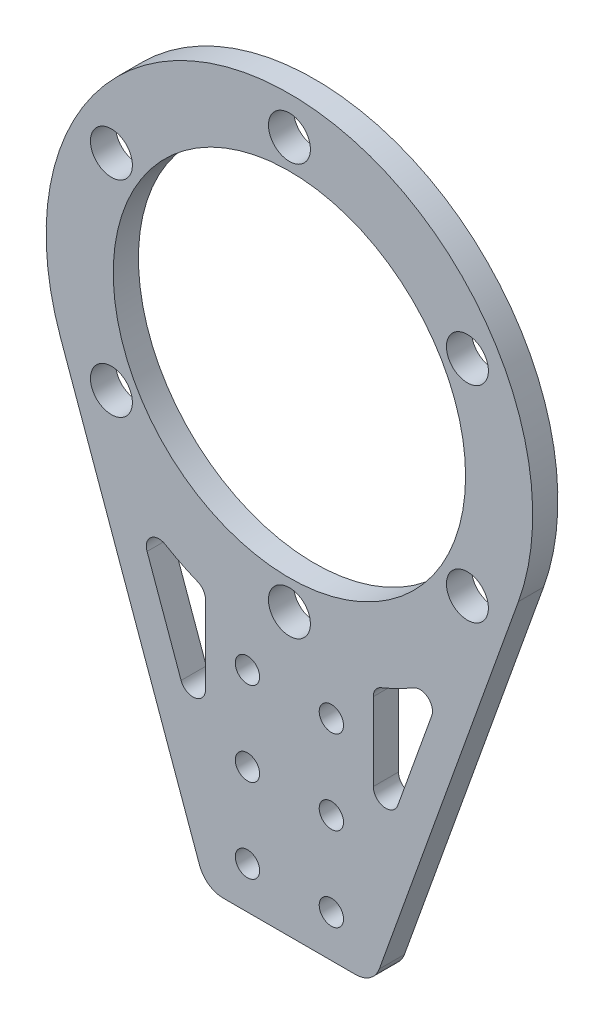
ISO-10303-21;
HEADER;
FILE_DESCRIPTION(('STEP AP214'),'2;1');
FILE_NAME('part.step','',(''),(''),'','','');
FILE_SCHEMA(('AUTOMOTIVE_DESIGN { 1 0 10303 214 1 1 1 1 }'));
ENDSEC;
DATA;
#1=APPLICATION_CONTEXT('core data for automotive mechanical design processes');
#2=APPLICATION_PROTOCOL_DEFINITION('international standard','automotive_design',2000,#1);
#3=PRODUCT_CONTEXT('',#1,'mechanical');
#4=PRODUCT('Part','Part','',(#3));
#5=PRODUCT_RELATED_PRODUCT_CATEGORY('part','',(#4));
#6=PRODUCT_DEFINITION_FORMATION('','',#4);
#7=PRODUCT_DEFINITION_CONTEXT('part definition',#1,'design');
#8=PRODUCT_DEFINITION('design','',#6,#7);
#9=PRODUCT_DEFINITION_SHAPE('','',#8);
#10=(LENGTH_UNIT() NAMED_UNIT(*) SI_UNIT(.MILLI.,.METRE.));
#11=(NAMED_UNIT(*) PLANE_ANGLE_UNIT() SI_UNIT($,.RADIAN.));
#12=(NAMED_UNIT(*) SI_UNIT($,.STERADIAN.) SOLID_ANGLE_UNIT());
#13=UNCERTAINTY_MEASURE_WITH_UNIT(LENGTH_MEASURE(1.E-05),#10,'distance_accuracy_value','');
#14=(GEOMETRIC_REPRESENTATION_CONTEXT(3) GLOBAL_UNCERTAINTY_ASSIGNED_CONTEXT((#13)) GLOBAL_UNIT_ASSIGNED_CONTEXT((#10,
#11,#12)) REPRESENTATION_CONTEXT('',''));
#15=CARTESIAN_POINT('',(0.,0.,0.));
#16=DIRECTION('',(0.,0.,1.));
#17=DIRECTION('',(1.,0.,0.));
#18=AXIS2_PLACEMENT_3D('',#15,#16,#17);
#19=CARTESIAN_POINT('',(0.,0.,3.));
#20=DIRECTION('',(0.,0.,-1.));
#21=DIRECTION('',(-1.,0.,0.));
#22=AXIS2_PLACEMENT_3D('',#19,#20,#21);
#23=PLANE('',#22);
#24=CARTESIAN_POINT('',(-5.,-33.,3.));
#25=DIRECTION('',(0.,0.,-1.));
#26=DIRECTION('',(-1.,0.,0.));
#27=AXIS2_PLACEMENT_3D('',#24,#25,#26);
#28=CIRCLE('',#27,1.45);
#29=CARTESIAN_POINT('',(-6.45,-33.,3.));
#30=VERTEX_POINT('',#29);
#31=EDGE_CURVE('E427',#30,#30,#28,.T.);
#32=ORIENTED_EDGE('',*,*,#31,.T.);
#33=EDGE_LOOP('',(#32));
#34=FACE_BOUND('',#33,.T.);
#35=CARTESIAN_POINT('',(-5.,-43.,3.));
#36=DIRECTION('',(0.,0.,-1.));
#37=DIRECTION('',(-1.,0.,0.));
#38=AXIS2_PLACEMENT_3D('',#35,#36,#37);
#39=CIRCLE('',#38,1.45);
#40=CARTESIAN_POINT('',(-6.45,-43.,3.));
#41=VERTEX_POINT('',#40);
#42=EDGE_CURVE('E434',#41,#41,#39,.T.);
#43=ORIENTED_EDGE('',*,*,#42,.T.);
#44=EDGE_LOOP('',(#43));
#45=FACE_BOUND('',#44,.T.);
#46=CARTESIAN_POINT('',(-5.,-53.,3.));
#47=DIRECTION('',(0.,0.,-1.));
#48=DIRECTION('',(-1.,0.,0.));
#49=AXIS2_PLACEMENT_3D('',#46,#47,#48);
#50=CIRCLE('',#49,1.45);
#51=CARTESIAN_POINT('',(-6.45,-53.,3.));
#52=VERTEX_POINT('',#51);
#53=EDGE_CURVE('E438',#52,#52,#50,.T.);
#54=ORIENTED_EDGE('',*,*,#53,.T.);
#55=EDGE_LOOP('',(#54));
#56=FACE_BOUND('',#55,.T.);
#57=CARTESIAN_POINT('',(5.,-53.,3.));
#58=DIRECTION('',(0.,0.,-1.));
#59=DIRECTION('',(-1.,0.,0.));
#60=AXIS2_PLACEMENT_3D('',#57,#58,#59);
#61=CIRCLE('',#60,1.45);
#62=CARTESIAN_POINT('',(3.55,-53.,3.));
#63=VERTEX_POINT('',#62);
#64=EDGE_CURVE('E442',#63,#63,#61,.T.);
#65=ORIENTED_EDGE('',*,*,#64,.T.);
#66=EDGE_LOOP('',(#65));
#67=FACE_BOUND('',#66,.T.);
#68=CARTESIAN_POINT('',(5.,-43.,3.));
#69=DIRECTION('',(0.,0.,-1.));
#70=DIRECTION('',(-1.,0.,0.));
#71=AXIS2_PLACEMENT_3D('',#68,#69,#70);
#72=CIRCLE('',#71,1.45);
#73=CARTESIAN_POINT('',(3.55,-43.,3.));
#74=VERTEX_POINT('',#73);
#75=EDGE_CURVE('E446',#74,#74,#72,.T.);
#76=ORIENTED_EDGE('',*,*,#75,.T.);
#77=EDGE_LOOP('',(#76));
#78=FACE_BOUND('',#77,.T.);
#79=CARTESIAN_POINT('',(5.,-33.,3.));
#80=DIRECTION('',(0.,0.,-1.));
#81=DIRECTION('',(-1.,0.,0.));
#82=AXIS2_PLACEMENT_3D('',#79,#80,#81);
#83=CIRCLE('',#82,1.45);
#84=CARTESIAN_POINT('',(3.55,-33.,3.));
#85=VERTEX_POINT('',#84);
#86=EDGE_CURVE('E450',#85,#85,#83,.T.);
#87=ORIENTED_EDGE('',*,*,#86,.T.);
#88=EDGE_LOOP('',(#87));
#89=FACE_BOUND('',#88,.T.);
#90=DIRECTION('',(0.337715842640856,-0.941248112683036,0.));
#91=VECTOR('',#90,1.);
#92=CARTESIAN_POINT('',(-9.99999999999999,-46.1557229630657,3.));
#93=LINE('',#92,#91);
#94=CARTESIAN_POINT('',(-16.9652563993768,-26.742850919515,3.));
#95=VERTEX_POINT('',#94);
#96=CARTESIAN_POINT('',(-12.9118721690245,-38.0400415605107,3.));
#97=VERTEX_POINT('',#96);
#98=EDGE_CURVE('E355',#95,#97,#93,.T.);
#99=ORIENTED_EDGE('',*,*,#98,.F.);
#100=CARTESIAN_POINT('',(-15.5533842303522,-26.2362771555537,3.));
#101=DIRECTION('',(0.,0.,-1.));
#102=DIRECTION('',(-1.,0.,0.));
#103=AXIS2_PLACEMENT_3D('',#100,#101,#102);
#104=CIRCLE('',#103,1.5);
#105=CARTESIAN_POINT('',(-14.7884636944333,-24.9459684429855,3.));
#106=VERTEX_POINT('',#105);
#107=EDGE_CURVE('E283',#95,#106,#104,.T.);
#108=ORIENTED_EDGE('',*,*,#107,.T.);
#109=CARTESIAN_POINT('',(0.,0.,3.));
#110=DIRECTION('',(0.,0.,-1.));
#111=DIRECTION('',(-1.,0.,0.));
#112=AXIS2_PLACEMENT_3D('',#109,#110,#111);
#113=CIRCLE('',#112,29.);
#114=CARTESIAN_POINT('',(-10.9344262295082,-26.8596039254387,3.));
#115=VERTEX_POINT('',#114);
#116=EDGE_CURVE('E347',#115,#106,#113,.T.);
#117=ORIENTED_EDGE('',*,*,#116,.F.);
#118=CARTESIAN_POINT('',(-11.5,-28.2488937836511,3.));
#119=DIRECTION('',(0.,0.,-1.));
#120=DIRECTION('',(-1.,0.,0.));
#121=AXIS2_PLACEMENT_3D('',#118,#119,#120);
#122=CIRCLE('',#121,1.5);
#123=CARTESIAN_POINT('',(-9.99999999999999,-28.2488937836511,3.));
#124=VERTEX_POINT('',#123);
#125=EDGE_CURVE('E289',#115,#124,#122,.T.);
#126=ORIENTED_EDGE('',*,*,#125,.T.);
#127=DIRECTION('',(0.,1.,0.));
#128=VECTOR('',#127,1.);
#129=CARTESIAN_POINT('',(-9.99999999999999,-46.1557229630657,3.));
#130=LINE('',#129,#128);
#131=CARTESIAN_POINT('',(-9.99999999999999,-37.5334677965494,3.));
#132=VERTEX_POINT('',#131);
#133=EDGE_CURVE('E368',#132,#124,#130,.T.);
#134=ORIENTED_EDGE('',*,*,#133,.F.);
#135=CARTESIAN_POINT('',(-11.5,-37.5334677965494,3.));
#136=DIRECTION('',(0.,0.,-1.));
#137=DIRECTION('',(-1.,0.,0.));
#138=AXIS2_PLACEMENT_3D('',#135,#136,#137);
#139=CIRCLE('',#138,1.5);
#140=EDGE_CURVE('E277',#132,#97,#139,.T.);
#141=ORIENTED_EDGE('',*,*,#140,.T.);
#142=EDGE_LOOP('',(#99,#108,#117,#126,#134,#141));
#143=FACE_BOUND('',#142,.T.);
#144=DIRECTION('',(0.337715842640856,-0.941248112683036,0.));
#145=VECTOR('',#144,1.);
#146=CARTESIAN_POINT('',(-9.99999999999999,-58.,3.));
#147=LINE('',#146,#145);
#148=CARTESIAN_POINT('',(-27.296195267808,-9.79375943658482,3.));
#149=VERTEX_POINT('',#148);
#150=CARTESIAN_POINT('',(-10.7128742653178,-56.0131475279226,3.));
#151=VERTEX_POINT('',#150);
#152=EDGE_CURVE('E213',#149,#151,#147,.T.);
#153=ORIENTED_EDGE('',*,*,#152,.T.);
#154=CARTESIAN_POINT('',(-7.8891299272687,-55.,3.));
#155=DIRECTION('',(0.,0.,-1.));
#156=DIRECTION('',(-1.,0.,0.));
#157=AXIS2_PLACEMENT_3D('',#154,#155,#156);
#158=CIRCLE('',#157,3.);
#159=CARTESIAN_POINT('',(-7.8891299272687,-58.,3.));
#160=VERTEX_POINT('',#159);
#161=EDGE_CURVE('E54',#151,#160,#158,.F.);
#162=ORIENTED_EDGE('',*,*,#161,.T.);
#163=DIRECTION('',(1.,0.,0.));
#164=VECTOR('',#163,1.);
#165=CARTESIAN_POINT('',(-9.99999999999999,-58.,3.));
#166=LINE('',#165,#164);
#167=CARTESIAN_POINT('',(7.88912992726872,-58.,3.));
#168=VERTEX_POINT('',#167);
#169=EDGE_CURVE('E180',#160,#168,#166,.T.);
#170=ORIENTED_EDGE('',*,*,#169,.T.);
#171=CARTESIAN_POINT('',(7.88912992726871,-55.,3.));
#172=DIRECTION('',(0.,0.,-1.));
#173=DIRECTION('',(-1.,0.,0.));
#174=AXIS2_PLACEMENT_3D('',#171,#172,#173);
#175=CIRCLE('',#174,3.);
#176=CARTESIAN_POINT('',(10.7128742653178,-56.0131475279226,3.));
#177=VERTEX_POINT('',#176);
#178=EDGE_CURVE('E61',#168,#177,#175,.F.);
#179=ORIENTED_EDGE('',*,*,#178,.T.);
#180=DIRECTION('',(0.337715842640856,0.941248112683036,0.));
#181=VECTOR('',#180,1.);
#182=CARTESIAN_POINT('',(10.,-58.,3.));
#183=LINE('',#182,#181);
#184=CARTESIAN_POINT('',(27.296195267808,-9.79375943658482,3.));
#185=VERTEX_POINT('',#184);
#186=EDGE_CURVE('E171',#177,#185,#183,.T.);
#187=ORIENTED_EDGE('',*,*,#186,.T.);
#188=CARTESIAN_POINT('',(0.,0.,3.));
#189=DIRECTION('',(0.,0.,1.));
#190=DIRECTION('',(-1.,0.,0.));
#191=AXIS2_PLACEMENT_3D('',#188,#189,#190);
#192=CIRCLE('',#191,29.);
#193=EDGE_CURVE('E175',#185,#149,#192,.T.);
#194=ORIENTED_EDGE('',*,*,#193,.T.);
#195=EDGE_LOOP('',(#153,#162,#170,#179,#187,#194));
#196=FACE_BOUND('',#195,.T.);
#197=CARTESIAN_POINT('',(0.,0.,3.));
#198=DIRECTION('',(0.,0.,1.));
#199=DIRECTION('',(1.,0.,0.));
#200=AXIS2_PLACEMENT_3D('',#197,#198,#199);
#201=CIRCLE('',#200,21.);
#202=CARTESIAN_POINT('',(21.,0.,3.));
#203=VERTEX_POINT('',#202);
#204=EDGE_CURVE('E205',#203,#203,#201,.T.);
#205=ORIENTED_EDGE('',*,*,#204,.F.);
#206=EDGE_LOOP('',(#205));
#207=FACE_BOUND('',#206,.T.);
#208=CARTESIAN_POINT('',(0.,24.5,3.));
#209=DIRECTION('',(0.,0.,1.));
#210=DIRECTION('',(1.,0.,0.));
#211=AXIS2_PLACEMENT_3D('',#208,#209,#210);
#212=CIRCLE('',#211,2.5);
#213=CARTESIAN_POINT('',(2.5,24.5,3.));
#214=VERTEX_POINT('',#213);
#215=EDGE_CURVE('E331',#214,#214,#212,.T.);
#216=ORIENTED_EDGE('',*,*,#215,.F.);
#217=EDGE_LOOP('',(#216));
#218=FACE_BOUND('',#217,.T.);
#219=CARTESIAN_POINT('',(21.2176223927188,12.25,3.));
#220=DIRECTION('',(0.,0.,1.));
#221=DIRECTION('',(1.,0.,0.));
#222=AXIS2_PLACEMENT_3D('',#219,#220,#221);
#223=CIRCLE('',#222,2.5);
#224=CARTESIAN_POINT('',(23.7176223927188,12.25,3.));
#225=VERTEX_POINT('',#224);
#226=EDGE_CURVE('E339',#225,#225,#223,.T.);
#227=ORIENTED_EDGE('',*,*,#226,.F.);
#228=EDGE_LOOP('',(#227));
#229=FACE_BOUND('',#228,.T.);
#230=DIRECTION('',(0.337715842640856,0.941248112683036,0.));
#231=VECTOR('',#230,1.);
#232=CARTESIAN_POINT('',(10.,-46.1557229630657,3.));
#233=LINE('',#232,#231);
#234=CARTESIAN_POINT('',(12.9118721690246,-38.0400415605107,3.));
#235=VERTEX_POINT('',#234);
#236=CARTESIAN_POINT('',(16.9652563993768,-26.742850919515,3.));
#237=VERTEX_POINT('',#236);
#238=EDGE_CURVE('E379',#235,#237,#233,.T.);
#239=ORIENTED_EDGE('',*,*,#238,.F.);
#240=CARTESIAN_POINT('',(11.5,-37.5334677965494,3.));
#241=DIRECTION('',(0.,0.,-1.));
#242=DIRECTION('',(-1.,0.,0.));
#243=AXIS2_PLACEMENT_3D('',#240,#241,#242);
#244=CIRCLE('',#243,1.5);
#245=CARTESIAN_POINT('',(10.,-37.5334677965494,3.));
#246=VERTEX_POINT('',#245);
#247=EDGE_CURVE('E265',#235,#246,#244,.T.);
#248=ORIENTED_EDGE('',*,*,#247,.T.);
#249=DIRECTION('',(0.,-1.,0.));
#250=VECTOR('',#249,1.);
#251=CARTESIAN_POINT('',(10.,-46.1557229630657,3.));
#252=LINE('',#251,#250);
#253=CARTESIAN_POINT('',(10.,-28.2488937836511,3.));
#254=VERTEX_POINT('',#253);
#255=EDGE_CURVE('E364',#254,#246,#252,.T.);
#256=ORIENTED_EDGE('',*,*,#255,.F.);
#257=CARTESIAN_POINT('',(11.5,-28.2488937836511,3.));
#258=DIRECTION('',(0.,0.,-1.));
#259=DIRECTION('',(-1.,0.,0.));
#260=AXIS2_PLACEMENT_3D('',#257,#258,#259);
#261=CIRCLE('',#260,1.5);
#262=CARTESIAN_POINT('',(10.9344262295082,-26.8596039254387,3.));
#263=VERTEX_POINT('',#262);
#264=EDGE_CURVE('E271',#254,#263,#261,.T.);
#265=ORIENTED_EDGE('',*,*,#264,.T.);
#266=CARTESIAN_POINT('',(0.,0.,3.));
#267=DIRECTION('',(0.,0.,-1.));
#268=DIRECTION('',(1.,0.,0.));
#269=AXIS2_PLACEMENT_3D('',#266,#267,#268);
#270=CIRCLE('',#269,29.);
#271=CARTESIAN_POINT('',(14.7884636944333,-24.9459684429855,3.));
#272=VERTEX_POINT('',#271);
#273=EDGE_CURVE('E392',#272,#263,#270,.T.);
#274=ORIENTED_EDGE('',*,*,#273,.F.);
#275=CARTESIAN_POINT('',(15.5533842303523,-26.2362771555537,3.));
#276=DIRECTION('',(0.,0.,-1.));
#277=DIRECTION('',(-1.,0.,0.));
#278=AXIS2_PLACEMENT_3D('',#275,#276,#277);
#279=CIRCLE('',#278,1.5);
#280=EDGE_CURVE('E259',#272,#237,#279,.T.);
#281=ORIENTED_EDGE('',*,*,#280,.T.);
#282=EDGE_LOOP('',(#239,#248,#256,#265,#274,#281));
#283=FACE_BOUND('',#282,.T.);
#284=CARTESIAN_POINT('',(21.2176223927187,-12.2500000000001,3.));
#285=DIRECTION('',(0.,0.,1.));
#286=DIRECTION('',(1.,0.,0.));
#287=AXIS2_PLACEMENT_3D('',#284,#285,#286);
#288=CIRCLE('',#287,2.5);
#289=CARTESIAN_POINT('',(23.7176223927187,-12.2500000000001,3.));
#290=VERTEX_POINT('',#289);
#291=EDGE_CURVE('E388',#290,#290,#288,.T.);
#292=ORIENTED_EDGE('',*,*,#291,.F.);
#293=EDGE_LOOP('',(#292));
#294=FACE_BOUND('',#293,.T.);
#295=CARTESIAN_POINT('',(-1.71082585603314E-13,-24.5,3.));
#296=DIRECTION('',(0.,0.,1.));
#297=DIRECTION('',(1.,0.,0.));
#298=AXIS2_PLACEMENT_3D('',#295,#296,#297);
#299=CIRCLE('',#298,2.5);
#300=CARTESIAN_POINT('',(2.49999999999983,-24.5,3.));
#301=VERTEX_POINT('',#300);
#302=EDGE_CURVE('E403',#301,#301,#299,.T.);
#303=ORIENTED_EDGE('',*,*,#302,.F.);
#304=EDGE_LOOP('',(#303));
#305=FACE_BOUND('',#304,.T.);
#306=CARTESIAN_POINT('',(-21.2176223927189,-12.2499999999998,3.));
#307=DIRECTION('',(0.,0.,1.));
#308=DIRECTION('',(1.,0.,0.));
#309=AXIS2_PLACEMENT_3D('',#306,#307,#308);
#310=CIRCLE('',#309,2.5);
#311=CARTESIAN_POINT('',(-18.7176223927189,-12.2499999999998,3.));
#312=VERTEX_POINT('',#311);
#313=EDGE_CURVE('E411',#312,#312,#310,.T.);
#314=ORIENTED_EDGE('',*,*,#313,.F.);
#315=EDGE_LOOP('',(#314));
#316=FACE_BOUND('',#315,.T.);
#317=CARTESIAN_POINT('',(-21.2176223927186,12.2500000000002,3.));
#318=DIRECTION('',(0.,0.,1.));
#319=DIRECTION('',(1.,0.,0.));
#320=AXIS2_PLACEMENT_3D('',#317,#318,#319);
#321=CIRCLE('',#320,2.5);
#322=CARTESIAN_POINT('',(-18.7176223927186,12.2500000000002,3.));
#323=VERTEX_POINT('',#322);
#324=EDGE_CURVE('E419',#323,#323,#321,.T.);
#325=ORIENTED_EDGE('',*,*,#324,.F.);
#326=EDGE_LOOP('',(#325));
#327=FACE_BOUND('',#326,.T.);
#328=ADVANCED_FACE('F45',(#34,#45,#56,#67,#78,#89,#143,#196,#207,#218,#229,#283,#294,#305,#316,
#327),#23,.F.);
#329=CARTESIAN_POINT('',(0.,0.,0.));
#330=DIRECTION('',(0.,0.,-1.));
#331=DIRECTION('',(-1.,0.,0.));
#332=AXIS2_PLACEMENT_3D('',#329,#330,#331);
#333=PLANE('',#332);
#334=CARTESIAN_POINT('',(-5.,-33.,0.));
#335=DIRECTION('',(0.,0.,-1.));
#336=DIRECTION('',(1.,0.,0.));
#337=AXIS2_PLACEMENT_3D('',#334,#335,#336);
#338=CIRCLE('',#337,1.45);
#339=CARTESIAN_POINT('',(-3.55,-33.,0.));
#340=VERTEX_POINT('',#339);
#341=EDGE_CURVE('E459',#340,#340,#338,.T.);
#342=ORIENTED_EDGE('',*,*,#341,.F.);
#343=EDGE_LOOP('',(#342));
#344=FACE_BOUND('',#343,.T.);
#345=CARTESIAN_POINT('',(-5.,-43.,0.));
#346=DIRECTION('',(0.,0.,-1.));
#347=DIRECTION('',(1.,0.,0.));
#348=AXIS2_PLACEMENT_3D('',#345,#346,#347);
#349=CIRCLE('',#348,1.45);
#350=CARTESIAN_POINT('',(-3.55,-43.,0.));
#351=VERTEX_POINT('',#350);
#352=EDGE_CURVE('E463',#351,#351,#349,.T.);
#353=ORIENTED_EDGE('',*,*,#352,.F.);
#354=EDGE_LOOP('',(#353));
#355=FACE_BOUND('',#354,.T.);
#356=CARTESIAN_POINT('',(-5.,-53.,0.));
#357=DIRECTION('',(0.,0.,-1.));
#358=DIRECTION('',(1.,0.,0.));
#359=AXIS2_PLACEMENT_3D('',#356,#357,#358);
#360=CIRCLE('',#359,1.45);
#361=CARTESIAN_POINT('',(-3.55,-53.,0.));
#362=VERTEX_POINT('',#361);
#363=EDGE_CURVE('E467',#362,#362,#360,.T.);
#364=ORIENTED_EDGE('',*,*,#363,.F.);
#365=EDGE_LOOP('',(#364));
#366=FACE_BOUND('',#365,.T.);
#367=CARTESIAN_POINT('',(5.,-53.,0.));
#368=DIRECTION('',(0.,0.,-1.));
#369=DIRECTION('',(-1.,0.,0.));
#370=AXIS2_PLACEMENT_3D('',#367,#368,#369);
#371=CIRCLE('',#370,1.45);
#372=CARTESIAN_POINT('',(3.55,-53.,0.));
#373=VERTEX_POINT('',#372);
#374=EDGE_CURVE('E471',#373,#373,#371,.T.);
#375=ORIENTED_EDGE('',*,*,#374,.F.);
#376=EDGE_LOOP('',(#375));
#377=FACE_BOUND('',#376,.T.);
#378=CARTESIAN_POINT('',(5.,-43.,0.));
#379=DIRECTION('',(0.,0.,-1.));
#380=DIRECTION('',(-1.,0.,0.));
#381=AXIS2_PLACEMENT_3D('',#378,#379,#380);
#382=CIRCLE('',#381,1.45);
#383=CARTESIAN_POINT('',(3.55,-43.,0.));
#384=VERTEX_POINT('',#383);
#385=EDGE_CURVE('E458',#384,#384,#382,.T.);
#386=ORIENTED_EDGE('',*,*,#385,.F.);
#387=EDGE_LOOP('',(#386));
#388=FACE_BOUND('',#387,.T.);
#389=CARTESIAN_POINT('',(5.,-33.,0.));
#390=DIRECTION('',(0.,0.,-1.));
#391=DIRECTION('',(-1.,0.,0.));
#392=AXIS2_PLACEMENT_3D('',#389,#390,#391);
#393=CIRCLE('',#392,1.45);
#394=CARTESIAN_POINT('',(3.55,-33.,0.));
#395=VERTEX_POINT('',#394);
#396=EDGE_CURVE('E454',#395,#395,#393,.T.);
#397=ORIENTED_EDGE('',*,*,#396,.F.);
#398=EDGE_LOOP('',(#397));
#399=FACE_BOUND('',#398,.T.);
#400=CARTESIAN_POINT('',(-21.2176223927189,-12.2499999999998,0.));
#401=DIRECTION('',(0.,0.,1.));
#402=DIRECTION('',(1.,0.,0.));
#403=AXIS2_PLACEMENT_3D('',#400,#401,#402);
#404=CIRCLE('',#403,2.5);
#405=CARTESIAN_POINT('',(-18.7176223927189,-12.2499999999998,0.));
#406=VERTEX_POINT('',#405);
#407=EDGE_CURVE('E415',#406,#406,#404,.T.);
#408=ORIENTED_EDGE('',*,*,#407,.T.);
#409=EDGE_LOOP('',(#408));
#410=FACE_BOUND('',#409,.T.);
#411=CARTESIAN_POINT('',(21.2176223927187,-12.2500000000001,0.));
#412=DIRECTION('',(0.,0.,1.));
#413=DIRECTION('',(1.,0.,0.));
#414=AXIS2_PLACEMENT_3D('',#411,#412,#413);
#415=CIRCLE('',#414,2.5);
#416=CARTESIAN_POINT('',(23.7176223927187,-12.2500000000001,0.));
#417=VERTEX_POINT('',#416);
#418=EDGE_CURVE('E399',#417,#417,#415,.T.);
#419=ORIENTED_EDGE('',*,*,#418,.T.);
#420=EDGE_LOOP('',(#419));
#421=FACE_BOUND('',#420,.T.);
#422=CARTESIAN_POINT('',(0.,24.5,0.));
#423=DIRECTION('',(0.,0.,1.));
#424=DIRECTION('',(1.,0.,0.));
#425=AXIS2_PLACEMENT_3D('',#422,#423,#424);
#426=CIRCLE('',#425,2.5);
#427=CARTESIAN_POINT('',(2.5,24.5,0.));
#428=VERTEX_POINT('',#427);
#429=EDGE_CURVE('E335',#428,#428,#426,.T.);
#430=ORIENTED_EDGE('',*,*,#429,.T.);
#431=EDGE_LOOP('',(#430));
#432=FACE_BOUND('',#431,.T.);
#433=DIRECTION('',(1.,0.,0.));
#434=VECTOR('',#433,1.);
#435=CARTESIAN_POINT('',(-9.99999999999999,-58.,0.));
#436=LINE('',#435,#434);
#437=CARTESIAN_POINT('',(-7.8891299272687,-58.,0.));
#438=VERTEX_POINT('',#437);
#439=CARTESIAN_POINT('',(7.88912992726872,-58.,0.));
#440=VERTEX_POINT('',#439);
#441=EDGE_CURVE('E204',#438,#440,#436,.T.);
#442=ORIENTED_EDGE('',*,*,#441,.F.);
#443=CARTESIAN_POINT('',(-7.8891299272687,-55.,0.));
#444=DIRECTION('',(0.,0.,-1.));
#445=DIRECTION('',(-1.,0.,0.));
#446=AXIS2_PLACEMENT_3D('',#443,#444,#445);
#447=CIRCLE('',#446,3.);
#448=CARTESIAN_POINT('',(-10.7128742653178,-56.0131475279226,0.));
#449=VERTEX_POINT('',#448);
#450=EDGE_CURVE('E302',#438,#449,#447,.T.);
#451=ORIENTED_EDGE('',*,*,#450,.T.);
#452=DIRECTION('',(0.337715842640856,-0.941248112683036,0.));
#453=VECTOR('',#452,1.);
#454=CARTESIAN_POINT('',(-9.99999999999999,-58.,0.));
#455=LINE('',#454,#453);
#456=CARTESIAN_POINT('',(-27.296195267808,-9.79375943658482,0.));
#457=VERTEX_POINT('',#456);
#458=EDGE_CURVE('E201',#457,#449,#455,.T.);
#459=ORIENTED_EDGE('',*,*,#458,.F.);
#460=CARTESIAN_POINT('',(0.,0.,0.));
#461=DIRECTION('',(0.,0.,1.));
#462=DIRECTION('',(-1.,0.,0.));
#463=AXIS2_PLACEMENT_3D('',#460,#461,#462);
#464=CIRCLE('',#463,29.);
#465=CARTESIAN_POINT('',(27.296195267808,-9.79375943658482,0.));
#466=VERTEX_POINT('',#465);
#467=EDGE_CURVE('E211',#466,#457,#464,.T.);
#468=ORIENTED_EDGE('',*,*,#467,.F.);
#469=DIRECTION('',(0.337715842640856,0.941248112683036,0.));
#470=VECTOR('',#469,1.);
#471=CARTESIAN_POINT('',(10.,-58.,0.));
#472=LINE('',#471,#470);
#473=CARTESIAN_POINT('',(10.7128742653178,-56.0131475279226,0.));
#474=VERTEX_POINT('',#473);
#475=EDGE_CURVE('E186',#474,#466,#472,.T.);
#476=ORIENTED_EDGE('',*,*,#475,.F.);
#477=CARTESIAN_POINT('',(7.88912992726871,-55.,0.));
#478=DIRECTION('',(0.,0.,-1.));
#479=DIRECTION('',(-1.,0.,0.));
#480=AXIS2_PLACEMENT_3D('',#477,#478,#479);
#481=CIRCLE('',#480,3.);
#482=EDGE_CURVE('E299',#474,#440,#481,.T.);
#483=ORIENTED_EDGE('',*,*,#482,.T.);
#484=EDGE_LOOP('',(#442,#451,#459,#468,#476,#483));
#485=FACE_BOUND('',#484,.T.);
#486=CARTESIAN_POINT('',(0.,0.,0.));
#487=DIRECTION('',(0.,0.,1.));
#488=DIRECTION('',(1.,0.,0.));
#489=AXIS2_PLACEMENT_3D('',#486,#487,#488);
#490=CIRCLE('',#489,21.);
#491=CARTESIAN_POINT('',(21.,0.,0.));
#492=VERTEX_POINT('',#491);
#493=EDGE_CURVE('E327',#492,#492,#490,.T.);
#494=ORIENTED_EDGE('',*,*,#493,.T.);
#495=EDGE_LOOP('',(#494));
#496=FACE_BOUND('',#495,.T.);
#497=CARTESIAN_POINT('',(21.2176223927188,12.25,0.));
#498=DIRECTION('',(0.,0.,1.));
#499=DIRECTION('',(1.,0.,0.));
#500=AXIS2_PLACEMENT_3D('',#497,#498,#499);
#501=CIRCLE('',#500,2.5);
#502=CARTESIAN_POINT('',(23.7176223927188,12.25,0.));
#503=VERTEX_POINT('',#502);
#504=EDGE_CURVE('E343',#503,#503,#501,.T.);
#505=ORIENTED_EDGE('',*,*,#504,.T.);
#506=EDGE_LOOP('',(#505));
#507=FACE_BOUND('',#506,.T.);
#508=DIRECTION('',(0.,1.,0.));
#509=VECTOR('',#508,1.);
#510=CARTESIAN_POINT('',(-9.99999999999999,-46.1557229630657,0.));
#511=LINE('',#510,#509);
#512=CARTESIAN_POINT('',(-9.99999999999999,-37.5334677965494,0.));
#513=VERTEX_POINT('',#512);
#514=CARTESIAN_POINT('',(-9.99999999999999,-28.2488937836511,0.));
#515=VERTEX_POINT('',#514);
#516=EDGE_CURVE('E356',#513,#515,#511,.T.);
#517=ORIENTED_EDGE('',*,*,#516,.T.);
#518=CARTESIAN_POINT('',(-11.5,-28.2488937836511,0.));
#519=DIRECTION('',(0.,0.,-1.));
#520=DIRECTION('',(-1.,0.,0.));
#521=AXIS2_PLACEMENT_3D('',#518,#519,#520);
#522=CIRCLE('',#521,1.5);
#523=CARTESIAN_POINT('',(-10.9344262295082,-26.8596039254387,0.));
#524=VERTEX_POINT('',#523);
#525=EDGE_CURVE('E286',#515,#524,#522,.F.);
#526=ORIENTED_EDGE('',*,*,#525,.T.);
#527=CARTESIAN_POINT('',(0.,0.,0.));
#528=DIRECTION('',(0.,0.,-1.));
#529=DIRECTION('',(-1.,0.,0.));
#530=AXIS2_PLACEMENT_3D('',#527,#528,#529);
#531=CIRCLE('',#530,29.);
#532=CARTESIAN_POINT('',(-14.7884636944333,-24.9459684429855,0.));
#533=VERTEX_POINT('',#532);
#534=EDGE_CURVE('E351',#524,#533,#531,.T.);
#535=ORIENTED_EDGE('',*,*,#534,.T.);
#536=CARTESIAN_POINT('',(-15.5533842303522,-26.2362771555537,0.));
#537=DIRECTION('',(0.,0.,-1.));
#538=DIRECTION('',(-1.,0.,0.));
#539=AXIS2_PLACEMENT_3D('',#536,#537,#538);
#540=CIRCLE('',#539,1.5);
#541=CARTESIAN_POINT('',(-16.9652563993768,-26.742850919515,0.));
#542=VERTEX_POINT('',#541);
#543=EDGE_CURVE('E280',#533,#542,#540,.F.);
#544=ORIENTED_EDGE('',*,*,#543,.T.);
#545=DIRECTION('',(0.337715842640856,-0.941248112683036,0.));
#546=VECTOR('',#545,1.);
#547=CARTESIAN_POINT('',(-9.99999999999999,-46.1557229630657,0.));
#548=LINE('',#547,#546);
#549=CARTESIAN_POINT('',(-12.9118721690245,-38.0400415605107,0.));
#550=VERTEX_POINT('',#549);
#551=EDGE_CURVE('E360',#542,#550,#548,.T.);
#552=ORIENTED_EDGE('',*,*,#551,.T.);
#553=CARTESIAN_POINT('',(-11.5,-37.5334677965494,0.));
#554=DIRECTION('',(0.,0.,-1.));
#555=DIRECTION('',(-1.,0.,0.));
#556=AXIS2_PLACEMENT_3D('',#553,#554,#555);
#557=CIRCLE('',#556,1.5);
#558=EDGE_CURVE('E274',#550,#513,#557,.F.);
#559=ORIENTED_EDGE('',*,*,#558,.T.);
#560=EDGE_LOOP('',(#517,#526,#535,#544,#552,#559));
#561=FACE_BOUND('',#560,.T.);
#562=CARTESIAN_POINT('',(0.,0.,0.));
#563=DIRECTION('',(0.,0.,-1.));
#564=DIRECTION('',(1.,0.,0.));
#565=AXIS2_PLACEMENT_3D('',#562,#563,#564);
#566=CIRCLE('',#565,29.);
#567=CARTESIAN_POINT('',(14.7884636944333,-24.9459684429855,0.));
#568=VERTEX_POINT('',#567);
#569=CARTESIAN_POINT('',(10.9344262295082,-26.8596039254387,0.));
#570=VERTEX_POINT('',#569);
#571=EDGE_CURVE('E380',#568,#570,#566,.T.);
#572=ORIENTED_EDGE('',*,*,#571,.T.);
#573=CARTESIAN_POINT('',(11.5,-28.2488937836511,0.));
#574=DIRECTION('',(0.,0.,-1.));
#575=DIRECTION('',(-1.,0.,0.));
#576=AXIS2_PLACEMENT_3D('',#573,#574,#575);
#577=CIRCLE('',#576,1.5);
#578=CARTESIAN_POINT('',(10.,-28.2488937836511,0.));
#579=VERTEX_POINT('',#578);
#580=EDGE_CURVE('E268',#570,#579,#577,.F.);
#581=ORIENTED_EDGE('',*,*,#580,.T.);
#582=DIRECTION('',(0.,-1.,0.));
#583=VECTOR('',#582,1.);
#584=CARTESIAN_POINT('',(10.,-46.1557229630657,0.));
#585=LINE('',#584,#583);
#586=CARTESIAN_POINT('',(10.,-37.5334677965494,0.));
#587=VERTEX_POINT('',#586);
#588=EDGE_CURVE('E375',#579,#587,#585,.T.);
#589=ORIENTED_EDGE('',*,*,#588,.T.);
#590=CARTESIAN_POINT('',(11.5,-37.5334677965494,0.));
#591=DIRECTION('',(0.,0.,-1.));
#592=DIRECTION('',(-1.,0.,0.));
#593=AXIS2_PLACEMENT_3D('',#590,#591,#592);
#594=CIRCLE('',#593,1.5);
#595=CARTESIAN_POINT('',(12.9118721690246,-38.0400415605107,0.));
#596=VERTEX_POINT('',#595);
#597=EDGE_CURVE('E262',#587,#596,#594,.F.);
#598=ORIENTED_EDGE('',*,*,#597,.T.);
#599=DIRECTION('',(0.337715842640856,0.941248112683036,0.));
#600=VECTOR('',#599,1.);
#601=CARTESIAN_POINT('',(10.,-46.1557229630657,0.));
#602=LINE('',#601,#600);
#603=CARTESIAN_POINT('',(16.9652563993768,-26.742850919515,0.));
#604=VERTEX_POINT('',#603);
#605=EDGE_CURVE('E384',#596,#604,#602,.T.);
#606=ORIENTED_EDGE('',*,*,#605,.T.);
#607=CARTESIAN_POINT('',(15.5533842303523,-26.2362771555537,0.));
#608=DIRECTION('',(0.,0.,-1.));
#609=DIRECTION('',(-1.,0.,0.));
#610=AXIS2_PLACEMENT_3D('',#607,#608,#609);
#611=CIRCLE('',#610,1.5);
#612=EDGE_CURVE('E256',#604,#568,#611,.F.);
#613=ORIENTED_EDGE('',*,*,#612,.T.);
#614=EDGE_LOOP('',(#572,#581,#589,#598,#606,#613));
#615=FACE_BOUND('',#614,.T.);
#616=CARTESIAN_POINT('',(-1.71082585603314E-13,-24.5,0.));
#617=DIRECTION('',(0.,0.,1.));
#618=DIRECTION('',(1.,0.,0.));
#619=AXIS2_PLACEMENT_3D('',#616,#617,#618);
#620=CIRCLE('',#619,2.5);
#621=CARTESIAN_POINT('',(2.49999999999983,-24.5,0.));
#622=VERTEX_POINT('',#621);
#623=EDGE_CURVE('E407',#622,#622,#620,.T.);
#624=ORIENTED_EDGE('',*,*,#623,.T.);
#625=EDGE_LOOP('',(#624));
#626=FACE_BOUND('',#625,.T.);
#627=CARTESIAN_POINT('',(-21.2176223927186,12.2500000000002,0.));
#628=DIRECTION('',(0.,0.,1.));
#629=DIRECTION('',(1.,0.,0.));
#630=AXIS2_PLACEMENT_3D('',#627,#628,#629);
#631=CIRCLE('',#630,2.5);
#632=CARTESIAN_POINT('',(-18.7176223927186,12.2500000000002,0.));
#633=VERTEX_POINT('',#632);
#634=EDGE_CURVE('E423',#633,#633,#631,.T.);
#635=ORIENTED_EDGE('',*,*,#634,.T.);
#636=EDGE_LOOP('',(#635));
#637=FACE_BOUND('',#636,.T.);
#638=ADVANCED_FACE('F321',(#344,#355,#366,#377,#388,#399,#410,#421,#432,#485,#496,#507,#561,
#615,#626,#637),#333,.T.);
#639=CARTESIAN_POINT('',(-9.99999999999999,-58.,3.));
#640=DIRECTION('',(0.941248112683036,0.337715842640856,0.));
#641=DIRECTION('',(-0.337715842640856,0.941248112683036,0.));
#642=AXIS2_PLACEMENT_3D('',#639,#640,#641);
#643=PLANE('',#642);
#644=ORIENTED_EDGE('',*,*,#458,.T.);
#645=DIRECTION('',(0.,0.,-1.));
#646=VECTOR('',#645,1.);
#647=CARTESIAN_POINT('',(-10.7128742653178,-56.0131475279226,3.));
#648=LINE('',#647,#646);
#649=EDGE_CURVE('E69',#449,#151,#648,.F.);
#650=ORIENTED_EDGE('',*,*,#649,.T.);
#651=ORIENTED_EDGE('',*,*,#152,.F.);
#652=DIRECTION('',(0.,0.,-1.));
#653=VECTOR('',#652,1.);
#654=CARTESIAN_POINT('',(-27.296195267808,-9.79375943658482,3.));
#655=LINE('',#654,#653);
#656=EDGE_CURVE('E191',#149,#457,#655,.T.);
#657=ORIENTED_EDGE('',*,*,#656,.T.);
#658=EDGE_LOOP('',(#644,#650,#651,#657));
#659=FACE_BOUND('',#658,.T.);
#660=ADVANCED_FACE('F323',(#659),#643,.F.);
#661=CARTESIAN_POINT('',(-9.99999999999999,-58.,3.));
#662=DIRECTION('',(0.,1.,0.));
#663=DIRECTION('',(0.,0.,1.));
#664=AXIS2_PLACEMENT_3D('',#661,#662,#663);
#665=PLANE('',#664);
#666=ORIENTED_EDGE('',*,*,#169,.F.);
#667=DIRECTION('',(0.,0.,-1.));
#668=VECTOR('',#667,1.);
#669=CARTESIAN_POINT('',(-7.8891299272687,-58.,3.));
#670=LINE('',#669,#668);
#671=EDGE_CURVE('E295',#160,#438,#670,.T.);
#672=ORIENTED_EDGE('',*,*,#671,.T.);
#673=ORIENTED_EDGE('',*,*,#441,.T.);
#674=DIRECTION('',(0.,0.,-1.));
#675=VECTOR('',#674,1.);
#676=CARTESIAN_POINT('',(7.88912992726872,-58.,3.));
#677=LINE('',#676,#675);
#678=EDGE_CURVE('E292',#440,#168,#677,.F.);
#679=ORIENTED_EDGE('',*,*,#678,.T.);
#680=EDGE_LOOP('',(#666,#672,#673,#679));
#681=FACE_BOUND('',#680,.T.);
#682=ADVANCED_FACE('F314',(#681),#665,.F.);
#683=CARTESIAN_POINT('',(10.,-58.,3.));
#684=DIRECTION('',(-0.941248112683036,0.337715842640856,0.));
#685=DIRECTION('',(-0.337715842640856,-0.941248112683036,0.));
#686=AXIS2_PLACEMENT_3D('',#683,#684,#685);
#687=PLANE('',#686);
#688=ORIENTED_EDGE('',*,*,#186,.F.);
#689=DIRECTION('',(0.,0.,-1.));
#690=VECTOR('',#689,1.);
#691=CARTESIAN_POINT('',(10.7128742653178,-56.0131475279226,3.));
#692=LINE('',#691,#690);
#693=EDGE_CURVE('E11',#177,#474,#692,.T.);
#694=ORIENTED_EDGE('',*,*,#693,.T.);
#695=ORIENTED_EDGE('',*,*,#475,.T.);
#696=DIRECTION('',(0.,0.,-1.));
#697=VECTOR('',#696,1.);
#698=CARTESIAN_POINT('',(27.296195267808,-9.79375943658482,3.));
#699=LINE('',#698,#697);
#700=EDGE_CURVE('E183',#185,#466,#699,.T.);
#701=ORIENTED_EDGE('',*,*,#700,.F.);
#702=EDGE_LOOP('',(#688,#694,#695,#701));
#703=FACE_BOUND('',#702,.T.);
#704=ADVANCED_FACE('F184',(#703),#687,.F.);
#705=CARTESIAN_POINT('',(0.,0.,3.));
#706=DIRECTION('',(0.,0.,-1.));
#707=DIRECTION('',(-1.,0.,0.));
#708=AXIS2_PLACEMENT_3D('',#705,#706,#707);
#709=CYLINDRICAL_SURFACE('',#708,29.);
#710=ORIENTED_EDGE('',*,*,#467,.T.);
#711=ORIENTED_EDGE('',*,*,#656,.F.);
#712=ORIENTED_EDGE('',*,*,#193,.F.);
#713=ORIENTED_EDGE('',*,*,#700,.T.);
#714=EDGE_LOOP('',(#710,#711,#712,#713));
#715=FACE_BOUND('',#714,.T.);
#716=ADVANCED_FACE('F193',(#715),#709,.T.);
#717=CARTESIAN_POINT('',(0.,0.,3.));
#718=DIRECTION('',(0.,0.,-1.));
#719=DIRECTION('',(-1.,0.,0.));
#720=AXIS2_PLACEMENT_3D('',#717,#718,#719);
#721=CYLINDRICAL_SURFACE('',#720,21.);
#722=ORIENTED_EDGE('',*,*,#204,.T.);
#723=EDGE_LOOP('',(#722));
#724=FACE_BOUND('',#723,.T.);
#725=ORIENTED_EDGE('',*,*,#493,.F.);
#726=EDGE_LOOP('',(#725));
#727=FACE_BOUND('',#726,.T.);
#728=ADVANCED_FACE('F497',(#724,#727),#721,.F.);
#729=CARTESIAN_POINT('',(0.,24.5,3.));
#730=DIRECTION('',(0.,0.,-1.));
#731=DIRECTION('',(-1.,0.,0.));
#732=AXIS2_PLACEMENT_3D('',#729,#730,#731);
#733=CYLINDRICAL_SURFACE('',#732,2.5);
#734=ORIENTED_EDGE('',*,*,#215,.T.);
#735=EDGE_LOOP('',(#734));
#736=FACE_BOUND('',#735,.T.);
#737=ORIENTED_EDGE('',*,*,#429,.F.);
#738=EDGE_LOOP('',(#737));
#739=FACE_BOUND('',#738,.T.);
#740=ADVANCED_FACE('F494',(#736,#739),#733,.F.);
#741=CARTESIAN_POINT('',(21.2176223927188,12.25,3.));
#742=DIRECTION('',(0.,0.,-1.));
#743=DIRECTION('',(-1.,0.,0.));
#744=AXIS2_PLACEMENT_3D('',#741,#742,#743);
#745=CYLINDRICAL_SURFACE('',#744,2.5);
#746=ORIENTED_EDGE('',*,*,#226,.T.);
#747=EDGE_LOOP('',(#746));
#748=FACE_BOUND('',#747,.T.);
#749=ORIENTED_EDGE('',*,*,#504,.F.);
#750=EDGE_LOOP('',(#749));
#751=FACE_BOUND('',#750,.T.);
#752=ADVANCED_FACE('F496',(#748,#751),#745,.F.);
#753=CARTESIAN_POINT('',(-9.99999999999999,-46.1557229630657,3.));
#754=DIRECTION('',(0.941248112683035,0.337715842640856,0.));
#755=DIRECTION('',(-0.337715842640856,0.941248112683036,0.));
#756=AXIS2_PLACEMENT_3D('',#753,#754,#755);
#757=PLANE('',#756);
#758=ORIENTED_EDGE('',*,*,#98,.T.);
#759=DIRECTION('',(0.,0.,-1.));
#760=VECTOR('',#759,1.);
#761=CARTESIAN_POINT('',(-12.9118721690245,-38.0400415605107,0.));
#762=LINE('',#761,#760);
#763=EDGE_CURVE('E238',#97,#550,#762,.T.);
#764=ORIENTED_EDGE('',*,*,#763,.T.);
#765=ORIENTED_EDGE('',*,*,#551,.F.);
#766=DIRECTION('',(0.,0.,1.));
#767=VECTOR('',#766,1.);
#768=CARTESIAN_POINT('',(-16.9652563993768,-26.742850919515,3.));
#769=LINE('',#768,#767);
#770=EDGE_CURVE('E235',#542,#95,#769,.T.);
#771=ORIENTED_EDGE('',*,*,#770,.T.);
#772=EDGE_LOOP('',(#758,#764,#765,#771));
#773=FACE_BOUND('',#772,.T.);
#774=ADVANCED_FACE('F504',(#773),#757,.T.);
#775=CARTESIAN_POINT('',(-9.99999999999999,-46.1557229630657,3.));
#776=DIRECTION('',(-1.,0.,0.));
#777=DIRECTION('',(0.,-1.,0.));
#778=AXIS2_PLACEMENT_3D('',#775,#776,#777);
#779=PLANE('',#778);
#780=ORIENTED_EDGE('',*,*,#516,.F.);
#781=DIRECTION('',(0.,0.,-1.));
#782=VECTOR('',#781,1.);
#783=CARTESIAN_POINT('',(-9.99999999999999,-37.5334677965494,3.));
#784=LINE('',#783,#782);
#785=EDGE_CURVE('E246',#513,#132,#784,.F.);
#786=ORIENTED_EDGE('',*,*,#785,.T.);
#787=ORIENTED_EDGE('',*,*,#133,.T.);
#788=DIRECTION('',(0.,0.,1.));
#789=VECTOR('',#788,1.);
#790=CARTESIAN_POINT('',(-9.99999999999999,-28.2488937836511,0.));
#791=LINE('',#790,#789);
#792=EDGE_CURVE('E242',#124,#515,#791,.F.);
#793=ORIENTED_EDGE('',*,*,#792,.T.);
#794=EDGE_LOOP('',(#780,#786,#787,#793));
#795=FACE_BOUND('',#794,.T.);
#796=ADVANCED_FACE('F601',(#795),#779,.T.);
#797=CARTESIAN_POINT('',(0.,0.,3.));
#798=DIRECTION('',(0.,0.,-1.));
#799=DIRECTION('',(-1.,0.,0.));
#800=AXIS2_PLACEMENT_3D('',#797,#798,#799);
#801=CYLINDRICAL_SURFACE('',#800,29.);
#802=ORIENTED_EDGE('',*,*,#116,.T.);
#803=DIRECTION('',(0.,0.,-1.));
#804=VECTOR('',#803,1.);
#805=CARTESIAN_POINT('',(-14.7884636944333,-24.9459684429855,3.));
#806=LINE('',#805,#804);
#807=EDGE_CURVE('E252',#106,#533,#806,.T.);
#808=ORIENTED_EDGE('',*,*,#807,.T.);
#809=ORIENTED_EDGE('',*,*,#534,.F.);
#810=DIRECTION('',(0.,0.,-1.));
#811=VECTOR('',#810,1.);
#812=CARTESIAN_POINT('',(-10.9344262295082,-26.8596039254387,3.));
#813=LINE('',#812,#811);
#814=EDGE_CURVE('E249',#524,#115,#813,.F.);
#815=ORIENTED_EDGE('',*,*,#814,.T.);
#816=EDGE_LOOP('',(#802,#808,#809,#815));
#817=FACE_BOUND('',#816,.T.);
#818=ADVANCED_FACE('F597',(#817),#801,.T.);
#819=CARTESIAN_POINT('',(10.,-46.1557229630657,3.));
#820=DIRECTION('',(-0.941248112683036,0.337715842640856,0.));
#821=DIRECTION('',(-0.337715842640856,-0.941248112683036,0.));
#822=AXIS2_PLACEMENT_3D('',#819,#820,#821);
#823=PLANE('',#822);
#824=ORIENTED_EDGE('',*,*,#238,.T.);
#825=DIRECTION('',(0.,0.,1.));
#826=VECTOR('',#825,1.);
#827=CARTESIAN_POINT('',(16.9652563993768,-26.742850919515,0.));
#828=LINE('',#827,#826);
#829=EDGE_CURVE('E217',#237,#604,#828,.F.);
#830=ORIENTED_EDGE('',*,*,#829,.T.);
#831=ORIENTED_EDGE('',*,*,#605,.F.);
#832=DIRECTION('',(0.,0.,-1.));
#833=VECTOR('',#832,1.);
#834=CARTESIAN_POINT('',(12.9118721690246,-38.0400415605107,3.));
#835=LINE('',#834,#833);
#836=EDGE_CURVE('E190',#596,#235,#835,.F.);
#837=ORIENTED_EDGE('',*,*,#836,.T.);
#838=EDGE_LOOP('',(#824,#830,#831,#837));
#839=FACE_BOUND('',#838,.T.);
#840=ADVANCED_FACE('F593',(#839),#823,.T.);
#841=CARTESIAN_POINT('',(0.,0.,3.));
#842=DIRECTION('',(0.,0.,-1.));
#843=DIRECTION('',(-1.,0.,0.));
#844=AXIS2_PLACEMENT_3D('',#841,#842,#843);
#845=CYLINDRICAL_SURFACE('',#844,29.);
#846=ORIENTED_EDGE('',*,*,#571,.F.);
#847=DIRECTION('',(0.,0.,-1.));
#848=VECTOR('',#847,1.);
#849=CARTESIAN_POINT('',(14.7884636944333,-24.9459684429855,3.));
#850=LINE('',#849,#848);
#851=EDGE_CURVE('E225',#568,#272,#850,.F.);
#852=ORIENTED_EDGE('',*,*,#851,.T.);
#853=ORIENTED_EDGE('',*,*,#273,.T.);
#854=DIRECTION('',(0.,0.,-1.));
#855=VECTOR('',#854,1.);
#856=CARTESIAN_POINT('',(10.9344262295082,-26.8596039254387,3.));
#857=LINE('',#856,#855);
#858=EDGE_CURVE('E221',#263,#570,#857,.T.);
#859=ORIENTED_EDGE('',*,*,#858,.T.);
#860=EDGE_LOOP('',(#846,#852,#853,#859));
#861=FACE_BOUND('',#860,.T.);
#862=ADVANCED_FACE('F589',(#861),#845,.T.);
#863=CARTESIAN_POINT('',(10.,-46.1557229630657,3.));
#864=DIRECTION('',(1.,0.,0.));
#865=DIRECTION('',(0.,1.,0.));
#866=AXIS2_PLACEMENT_3D('',#863,#864,#865);
#867=PLANE('',#866);
#868=ORIENTED_EDGE('',*,*,#255,.T.);
#869=DIRECTION('',(0.,0.,-1.));
#870=VECTOR('',#869,1.);
#871=CARTESIAN_POINT('',(10.,-37.5334677965494,0.));
#872=LINE('',#871,#870);
#873=EDGE_CURVE('E231',#246,#587,#872,.T.);
#874=ORIENTED_EDGE('',*,*,#873,.T.);
#875=ORIENTED_EDGE('',*,*,#588,.F.);
#876=DIRECTION('',(0.,0.,1.));
#877=VECTOR('',#876,1.);
#878=CARTESIAN_POINT('',(10.,-28.2488937836511,3.));
#879=LINE('',#878,#877);
#880=EDGE_CURVE('E228',#579,#254,#879,.T.);
#881=ORIENTED_EDGE('',*,*,#880,.T.);
#882=EDGE_LOOP('',(#868,#874,#875,#881));
#883=FACE_BOUND('',#882,.T.);
#884=ADVANCED_FACE('F585',(#883),#867,.T.);
#885=CARTESIAN_POINT('',(21.2176223927187,-12.2500000000001,3.));
#886=DIRECTION('',(0.,0.,-1.));
#887=DIRECTION('',(-1.,0.,0.));
#888=AXIS2_PLACEMENT_3D('',#885,#886,#887);
#889=CYLINDRICAL_SURFACE('',#888,2.5);
#890=ORIENTED_EDGE('',*,*,#291,.T.);
#891=EDGE_LOOP('',(#890));
#892=FACE_BOUND('',#891,.T.);
#893=ORIENTED_EDGE('',*,*,#418,.F.);
#894=EDGE_LOOP('',(#893));
#895=FACE_BOUND('',#894,.T.);
#896=ADVANCED_FACE('F581',(#892,#895),#889,.F.);
#897=CARTESIAN_POINT('',(-1.71082585603314E-13,-24.5,3.));
#898=DIRECTION('',(0.,0.,-1.));
#899=DIRECTION('',(-1.,0.,0.));
#900=AXIS2_PLACEMENT_3D('',#897,#898,#899);
#901=CYLINDRICAL_SURFACE('',#900,2.5);
#902=ORIENTED_EDGE('',*,*,#302,.T.);
#903=EDGE_LOOP('',(#902));
#904=FACE_BOUND('',#903,.T.);
#905=ORIENTED_EDGE('',*,*,#623,.F.);
#906=EDGE_LOOP('',(#905));
#907=FACE_BOUND('',#906,.T.);
#908=ADVANCED_FACE('F577',(#904,#907),#901,.F.);
#909=CARTESIAN_POINT('',(-21.2176223927189,-12.2499999999998,3.));
#910=DIRECTION('',(0.,0.,-1.));
#911=DIRECTION('',(-1.,0.,0.));
#912=AXIS2_PLACEMENT_3D('',#909,#910,#911);
#913=CYLINDRICAL_SURFACE('',#912,2.5);
#914=ORIENTED_EDGE('',*,*,#313,.T.);
#915=EDGE_LOOP('',(#914));
#916=FACE_BOUND('',#915,.T.);
#917=ORIENTED_EDGE('',*,*,#407,.F.);
#918=EDGE_LOOP('',(#917));
#919=FACE_BOUND('',#918,.T.);
#920=ADVANCED_FACE('F573',(#916,#919),#913,.F.);
#921=CARTESIAN_POINT('',(-21.2176223927186,12.2500000000002,3.));
#922=DIRECTION('',(0.,0.,-1.));
#923=DIRECTION('',(-1.,0.,0.));
#924=AXIS2_PLACEMENT_3D('',#921,#922,#923);
#925=CYLINDRICAL_SURFACE('',#924,2.5);
#926=ORIENTED_EDGE('',*,*,#324,.T.);
#927=EDGE_LOOP('',(#926));
#928=FACE_BOUND('',#927,.T.);
#929=ORIENTED_EDGE('',*,*,#634,.F.);
#930=EDGE_LOOP('',(#929));
#931=FACE_BOUND('',#930,.T.);
#932=ADVANCED_FACE('F529',(#928,#931),#925,.F.);
#933=CARTESIAN_POINT('',(15.5533842303523,-26.2362771555537,3.));
#934=DIRECTION('',(0.,0.,-1.));
#935=DIRECTION('',(-1.,0.,0.));
#936=AXIS2_PLACEMENT_3D('',#933,#934,#935);
#937=CYLINDRICAL_SURFACE('',#936,1.5);
#938=ORIENTED_EDGE('',*,*,#280,.F.);
#939=ORIENTED_EDGE('',*,*,#851,.F.);
#940=ORIENTED_EDGE('',*,*,#612,.F.);
#941=ORIENTED_EDGE('',*,*,#829,.F.);
#942=EDGE_LOOP('',(#938,#939,#940,#941));
#943=FACE_BOUND('',#942,.T.);
#944=ADVANCED_FACE('F525',(#943),#937,.F.);
#945=CARTESIAN_POINT('',(11.5,-37.5334677965494,3.));
#946=DIRECTION('',(0.,0.,1.));
#947=DIRECTION('',(1.,0.,0.));
#948=AXIS2_PLACEMENT_3D('',#945,#946,#947);
#949=CYLINDRICAL_SURFACE('',#948,1.5);
#950=ORIENTED_EDGE('',*,*,#247,.F.);
#951=ORIENTED_EDGE('',*,*,#836,.F.);
#952=ORIENTED_EDGE('',*,*,#597,.F.);
#953=ORIENTED_EDGE('',*,*,#873,.F.);
#954=EDGE_LOOP('',(#950,#951,#952,#953));
#955=FACE_BOUND('',#954,.T.);
#956=ADVANCED_FACE('F528',(#955),#949,.F.);
#957=CARTESIAN_POINT('',(11.5,-28.2488937836511,3.));
#958=DIRECTION('',(0.,0.,-1.));
#959=DIRECTION('',(-1.,0.,0.));
#960=AXIS2_PLACEMENT_3D('',#957,#958,#959);
#961=CYLINDRICAL_SURFACE('',#960,1.5);
#962=ORIENTED_EDGE('',*,*,#264,.F.);
#963=ORIENTED_EDGE('',*,*,#880,.F.);
#964=ORIENTED_EDGE('',*,*,#580,.F.);
#965=ORIENTED_EDGE('',*,*,#858,.F.);
#966=EDGE_LOOP('',(#962,#963,#964,#965));
#967=FACE_BOUND('',#966,.T.);
#968=ADVANCED_FACE('F533',(#967),#961,.F.);
#969=CARTESIAN_POINT('',(-11.5,-37.5334677965494,3.));
#970=DIRECTION('',(0.,0.,1.));
#971=DIRECTION('',(1.,0.,0.));
#972=AXIS2_PLACEMENT_3D('',#969,#970,#971);
#973=CYLINDRICAL_SURFACE('',#972,1.5);
#974=ORIENTED_EDGE('',*,*,#140,.F.);
#975=ORIENTED_EDGE('',*,*,#785,.F.);
#976=ORIENTED_EDGE('',*,*,#558,.F.);
#977=ORIENTED_EDGE('',*,*,#763,.F.);
#978=EDGE_LOOP('',(#974,#975,#976,#977));
#979=FACE_BOUND('',#978,.T.);
#980=ADVANCED_FACE('F537',(#979),#973,.F.);
#981=CARTESIAN_POINT('',(-15.5533842303522,-26.2362771555537,3.));
#982=DIRECTION('',(0.,0.,-1.));
#983=DIRECTION('',(-1.,0.,0.));
#984=AXIS2_PLACEMENT_3D('',#981,#982,#983);
#985=CYLINDRICAL_SURFACE('',#984,1.5);
#986=ORIENTED_EDGE('',*,*,#107,.F.);
#987=ORIENTED_EDGE('',*,*,#770,.F.);
#988=ORIENTED_EDGE('',*,*,#543,.F.);
#989=ORIENTED_EDGE('',*,*,#807,.F.);
#990=EDGE_LOOP('',(#986,#987,#988,#989));
#991=FACE_BOUND('',#990,.T.);
#992=ADVANCED_FACE('F541',(#991),#985,.F.);
#993=CARTESIAN_POINT('',(-11.5,-28.2488937836511,3.));
#994=DIRECTION('',(0.,0.,-1.));
#995=DIRECTION('',(-1.,0.,0.));
#996=AXIS2_PLACEMENT_3D('',#993,#994,#995);
#997=CYLINDRICAL_SURFACE('',#996,1.5);
#998=ORIENTED_EDGE('',*,*,#125,.F.);
#999=ORIENTED_EDGE('',*,*,#814,.F.);
#1000=ORIENTED_EDGE('',*,*,#525,.F.);
#1001=ORIENTED_EDGE('',*,*,#792,.F.);
#1002=EDGE_LOOP('',(#998,#999,#1000,#1001));
#1003=FACE_BOUND('',#1002,.T.);
#1004=ADVANCED_FACE('F545',(#1003),#997,.F.);
#1005=CARTESIAN_POINT('',(5.,-33.,5.));
#1006=DIRECTION('',(0.,0.,-1.));
#1007=DIRECTION('',(-1.,0.,0.));
#1008=AXIS2_PLACEMENT_3D('',#1005,#1006,#1007);
#1009=CYLINDRICAL_SURFACE('',#1008,1.45);
#1010=ORIENTED_EDGE('',*,*,#396,.T.);
#1011=EDGE_LOOP('',(#1010));
#1012=FACE_BOUND('',#1011,.T.);
#1013=ORIENTED_EDGE('',*,*,#86,.F.);
#1014=EDGE_LOOP('',(#1013));
#1015=FACE_BOUND('',#1014,.T.);
#1016=ADVANCED_FACE('F548',(#1012,#1015),#1009,.F.);
#1017=CARTESIAN_POINT('',(5.,-43.,5.));
#1018=DIRECTION('',(0.,0.,-1.));
#1019=DIRECTION('',(-1.,0.,0.));
#1020=AXIS2_PLACEMENT_3D('',#1017,#1018,#1019);
#1021=CYLINDRICAL_SURFACE('',#1020,1.45);
#1022=ORIENTED_EDGE('',*,*,#385,.T.);
#1023=EDGE_LOOP('',(#1022));
#1024=FACE_BOUND('',#1023,.T.);
#1025=ORIENTED_EDGE('',*,*,#75,.F.);
#1026=EDGE_LOOP('',(#1025));
#1027=FACE_BOUND('',#1026,.T.);
#1028=ADVANCED_FACE('F479',(#1024,#1027),#1021,.F.);
#1029=CARTESIAN_POINT('',(5.,-53.,5.));
#1030=DIRECTION('',(0.,0.,-1.));
#1031=DIRECTION('',(-1.,0.,0.));
#1032=AXIS2_PLACEMENT_3D('',#1029,#1030,#1031);
#1033=CYLINDRICAL_SURFACE('',#1032,1.45);
#1034=ORIENTED_EDGE('',*,*,#374,.T.);
#1035=EDGE_LOOP('',(#1034));
#1036=FACE_BOUND('',#1035,.T.);
#1037=ORIENTED_EDGE('',*,*,#64,.F.);
#1038=EDGE_LOOP('',(#1037));
#1039=FACE_BOUND('',#1038,.T.);
#1040=ADVANCED_FACE('F731',(#1036,#1039),#1033,.F.);
#1041=CARTESIAN_POINT('',(-5.,-53.,5.));
#1042=DIRECTION('',(0.,0.,-1.));
#1043=DIRECTION('',(-1.,0.,0.));
#1044=AXIS2_PLACEMENT_3D('',#1041,#1042,#1043);
#1045=CYLINDRICAL_SURFACE('',#1044,1.45);
#1046=ORIENTED_EDGE('',*,*,#363,.T.);
#1047=EDGE_LOOP('',(#1046));
#1048=FACE_BOUND('',#1047,.T.);
#1049=ORIENTED_EDGE('',*,*,#53,.F.);
#1050=EDGE_LOOP('',(#1049));
#1051=FACE_BOUND('',#1050,.T.);
#1052=ADVANCED_FACE('F562',(#1048,#1051),#1045,.F.);
#1053=CARTESIAN_POINT('',(-5.,-43.,5.));
#1054=DIRECTION('',(0.,0.,-1.));
#1055=DIRECTION('',(-1.,0.,0.));
#1056=AXIS2_PLACEMENT_3D('',#1053,#1054,#1055);
#1057=CYLINDRICAL_SURFACE('',#1056,1.45);
#1058=ORIENTED_EDGE('',*,*,#352,.T.);
#1059=EDGE_LOOP('',(#1058));
#1060=FACE_BOUND('',#1059,.T.);
#1061=ORIENTED_EDGE('',*,*,#42,.F.);
#1062=EDGE_LOOP('',(#1061));
#1063=FACE_BOUND('',#1062,.T.);
#1064=ADVANCED_FACE('F556',(#1060,#1063),#1057,.F.);
#1065=CARTESIAN_POINT('',(-5.,-33.,5.));
#1066=DIRECTION('',(0.,0.,-1.));
#1067=DIRECTION('',(-1.,0.,0.));
#1068=AXIS2_PLACEMENT_3D('',#1065,#1066,#1067);
#1069=CYLINDRICAL_SURFACE('',#1068,1.45);
#1070=ORIENTED_EDGE('',*,*,#341,.T.);
#1071=EDGE_LOOP('',(#1070));
#1072=FACE_BOUND('',#1071,.T.);
#1073=ORIENTED_EDGE('',*,*,#31,.F.);
#1074=EDGE_LOOP('',(#1073));
#1075=FACE_BOUND('',#1074,.T.);
#1076=ADVANCED_FACE('F551',(#1072,#1075),#1069,.F.);
#1077=CARTESIAN_POINT('',(-7.8891299272687,-55.,3.));
#1078=DIRECTION('',(0.,0.,-1.));
#1079=DIRECTION('',(-1.,0.,0.));
#1080=AXIS2_PLACEMENT_3D('',#1077,#1078,#1079);
#1081=CYLINDRICAL_SURFACE('',#1080,3.);
#1082=ORIENTED_EDGE('',*,*,#161,.F.);
#1083=ORIENTED_EDGE('',*,*,#649,.F.);
#1084=ORIENTED_EDGE('',*,*,#450,.F.);
#1085=ORIENTED_EDGE('',*,*,#671,.F.);
#1086=EDGE_LOOP('',(#1082,#1083,#1084,#1085));
#1087=FACE_BOUND('',#1086,.T.);
#1088=ADVANCED_FACE('F318',(#1087),#1081,.T.);
#1089=CARTESIAN_POINT('',(7.88912992726871,-55.,3.));
#1090=DIRECTION('',(0.,0.,-1.));
#1091=DIRECTION('',(-1.,0.,0.));
#1092=AXIS2_PLACEMENT_3D('',#1089,#1090,#1091);
#1093=CYLINDRICAL_SURFACE('',#1092,3.);
#1094=ORIENTED_EDGE('',*,*,#178,.F.);
#1095=ORIENTED_EDGE('',*,*,#678,.F.);
#1096=ORIENTED_EDGE('',*,*,#482,.F.);
#1097=ORIENTED_EDGE('',*,*,#693,.F.);
#1098=EDGE_LOOP('',(#1094,#1095,#1096,#1097));
#1099=FACE_BOUND('',#1098,.T.);
#1100=ADVANCED_FACE('F47',(#1099),#1093,.T.);
#1101=CLOSED_SHELL('',(#328,#638,#660,#682,#704,#716,#728,#740,#752,#774,#796,#818,#840,#862,
#884,#896,#908,#920,#932,#944,#956,#968,#980,#992,#1004,#1016,#1028,#1040,#1052,#1064,#1076,
#1088,#1100));
#1102=MANIFOLD_SOLID_BREP('B2',#1101);
#1103=ADVANCED_BREP_SHAPE_REPRESENTATION('',(#18,#1102),#14);
#1104=SHAPE_DEFINITION_REPRESENTATION(#9,#1103);
ENDSEC;
END-ISO-10303-21;
